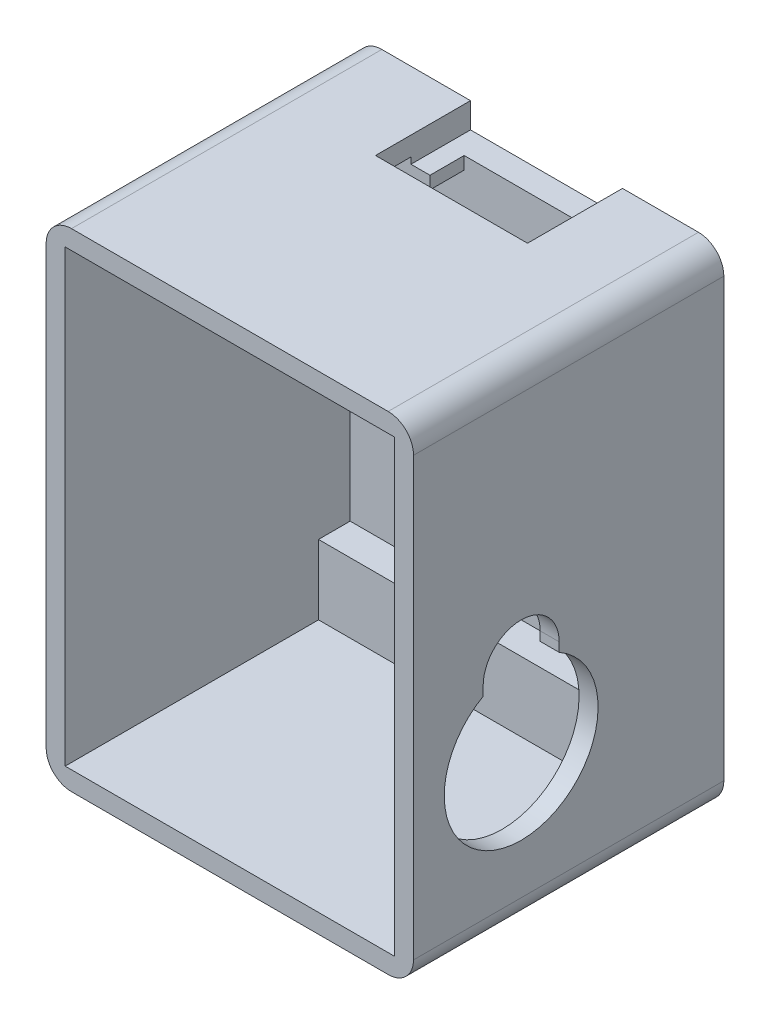
ISO-10303-21;
HEADER;
FILE_DESCRIPTION(('STEP AP214'),'2;1');
FILE_NAME('part.step','',(''),(''),'','','');
FILE_SCHEMA(('AUTOMOTIVE_DESIGN { 1 0 10303 214 1 1 1 1 }'));
ENDSEC;
DATA;
#1=APPLICATION_CONTEXT('core data for automotive mechanical design processes');
#2=APPLICATION_PROTOCOL_DEFINITION('international standard','automotive_design',2000,#1);
#3=PRODUCT_CONTEXT('',#1,'mechanical');
#4=PRODUCT('Part','Part','',(#3));
#5=PRODUCT_RELATED_PRODUCT_CATEGORY('part','',(#4));
#6=PRODUCT_DEFINITION_FORMATION('','',#4);
#7=PRODUCT_DEFINITION_CONTEXT('part definition',#1,'design');
#8=PRODUCT_DEFINITION('design','',#6,#7);
#9=PRODUCT_DEFINITION_SHAPE('','',#8);
#10=(LENGTH_UNIT() NAMED_UNIT(*) SI_UNIT(.MILLI.,.METRE.));
#11=(NAMED_UNIT(*) PLANE_ANGLE_UNIT() SI_UNIT($,.RADIAN.));
#12=(NAMED_UNIT(*) SI_UNIT($,.STERADIAN.) SOLID_ANGLE_UNIT());
#13=UNCERTAINTY_MEASURE_WITH_UNIT(LENGTH_MEASURE(1.E-05),#10,'distance_accuracy_value','');
#14=(GEOMETRIC_REPRESENTATION_CONTEXT(3) GLOBAL_UNCERTAINTY_ASSIGNED_CONTEXT((#13)) GLOBAL_UNIT_ASSIGNED_CONTEXT((#10,
#11,#12)) REPRESENTATION_CONTEXT('',''));
#15=CARTESIAN_POINT('',(0.,0.,0.));
#16=DIRECTION('',(0.,0.,1.));
#17=DIRECTION('',(1.,0.,0.));
#18=AXIS2_PLACEMENT_3D('',#15,#16,#17);
#19=CARTESIAN_POINT('',(27.5,0.,24.));
#20=DIRECTION('',(-1.,0.,0.));
#21=DIRECTION('',(0.,-1.,0.));
#22=AXIS2_PLACEMENT_3D('',#19,#20,#21);
#23=PLANE('',#22);
#24=DIRECTION('',(0.,0.,-1.));
#25=VECTOR('',#24,1.);
#26=CARTESIAN_POINT('',(27.5,-1.5,24.));
#27=LINE('',#26,#25);
#28=CARTESIAN_POINT('',(27.5,-1.5,24.));
#29=VERTEX_POINT('',#28);
#30=CARTESIAN_POINT('',(27.5,-1.5,4.2));
#31=VERTEX_POINT('',#30);
#32=EDGE_CURVE('E388',#29,#31,#27,.T.);
#33=ORIENTED_EDGE('',*,*,#32,.T.);
#34=DIRECTION('',(0.,1.,0.));
#35=VECTOR('',#34,1.);
#36=CARTESIAN_POINT('',(27.5,-1.5,4.2));
#37=LINE('',#36,#35);
#38=CARTESIAN_POINT('',(27.5,-3.,4.2));
#39=VERTEX_POINT('',#38);
#40=EDGE_CURVE('E341',#39,#31,#37,.T.);
#41=ORIENTED_EDGE('',*,*,#40,.F.);
#42=DIRECTION('',(0.,0.,1.));
#43=VECTOR('',#42,1.);
#44=CARTESIAN_POINT('',(27.5,-3.,4.2));
#45=LINE('',#44,#43);
#46=CARTESIAN_POINT('',(27.5,-3.,1.5));
#47=VERTEX_POINT('',#46);
#48=EDGE_CURVE('E346',#47,#39,#45,.T.);
#49=ORIENTED_EDGE('',*,*,#48,.F.);
#50=DIRECTION('',(0.,1.,0.));
#51=VECTOR('',#50,1.);
#52=CARTESIAN_POINT('',(27.5,0.,1.5));
#53=LINE('',#52,#51);
#54=CARTESIAN_POINT('',(27.5,-31.5,1.5));
#55=VERTEX_POINT('',#54);
#56=EDGE_CURVE('E379',#55,#47,#53,.T.);
#57=ORIENTED_EDGE('',*,*,#56,.F.);
#58=DIRECTION('',(0.,0.,-1.));
#59=VECTOR('',#58,1.);
#60=CARTESIAN_POINT('',(27.5,-31.5,4.));
#61=LINE('',#60,#59);
#62=CARTESIAN_POINT('',(27.5,-31.5,4.));
#63=VERTEX_POINT('',#62);
#64=EDGE_CURVE('E375',#63,#55,#61,.T.);
#65=ORIENTED_EDGE('',*,*,#64,.F.);
#66=DIRECTION('',(0.,1.,0.));
#67=VECTOR('',#66,1.);
#68=CARTESIAN_POINT('',(27.5,-31.5,4.));
#69=LINE('',#68,#67);
#70=CARTESIAN_POINT('',(27.5,-37.,4.));
#71=VERTEX_POINT('',#70);
#72=EDGE_CURVE('E361',#71,#63,#69,.T.);
#73=ORIENTED_EDGE('',*,*,#72,.F.);
#74=DIRECTION('',(0.,0.,-1.));
#75=VECTOR('',#74,1.);
#76=CARTESIAN_POINT('',(27.5,-37.,24.));
#77=LINE('',#76,#75);
#78=CARTESIAN_POINT('',(27.5,-37.,24.));
#79=VERTEX_POINT('',#78);
#80=EDGE_CURVE('E384',#79,#71,#77,.T.);
#81=ORIENTED_EDGE('',*,*,#80,.F.);
#82=DIRECTION('',(0.,1.,0.));
#83=VECTOR('',#82,1.);
#84=CARTESIAN_POINT('',(27.5,0.,24.));
#85=LINE('',#84,#83);
#86=EDGE_CURVE('E400',#79,#29,#85,.T.);
#87=ORIENTED_EDGE('',*,*,#86,.T.);
#88=EDGE_LOOP('',(#33,#41,#49,#57,#65,#73,#81,#87));
#89=FACE_BOUND('',#88,.T.);
#90=CARTESIAN_POINT('',(27.5,-26.5,15.5));
#91=DIRECTION('',(1.,0.,0.));
#92=DIRECTION('',(0.,1.,0.));
#93=AXIS2_PLACEMENT_3D('',#90,#91,#92);
#94=CIRCLE('',#93,6.07214716167935);
#95=CARTESIAN_POINT('',(27.5,-21.2207035361622,18.5));
#96=VERTEX_POINT('',#95);
#97=CARTESIAN_POINT('',(27.5,-21.2207035361622,12.5));
#98=VERTEX_POINT('',#97);
#99=EDGE_CURVE('E237',#96,#98,#94,.T.);
#100=ORIENTED_EDGE('',*,*,#99,.T.);
#101=DIRECTION('',(0.,-1.,0.));
#102=VECTOR('',#101,1.);
#103=CARTESIAN_POINT('',(27.5,0.,12.5));
#104=LINE('',#103,#102);
#105=CARTESIAN_POINT('',(27.5,-20.5,12.5));
#106=VERTEX_POINT('',#105);
#107=EDGE_CURVE('E231',#106,#98,#104,.T.);
#108=ORIENTED_EDGE('',*,*,#107,.F.);
#109=CARTESIAN_POINT('',(27.5,-20.5,15.5));
#110=DIRECTION('',(1.,0.,0.));
#111=DIRECTION('',(0.,1.,0.));
#112=AXIS2_PLACEMENT_3D('',#109,#110,#111);
#113=CIRCLE('',#112,3.);
#114=CARTESIAN_POINT('',(27.5,-20.5,18.5));
#115=VERTEX_POINT('',#114);
#116=EDGE_CURVE('E240',#106,#115,#113,.T.);
#117=ORIENTED_EDGE('',*,*,#116,.T.);
#118=DIRECTION('',(0.,-1.,0.));
#119=VECTOR('',#118,1.);
#120=CARTESIAN_POINT('',(27.5,0.,18.5));
#121=LINE('',#120,#119);
#122=EDGE_CURVE('E49',#115,#96,#121,.T.);
#123=ORIENTED_EDGE('',*,*,#122,.T.);
#124=EDGE_LOOP('',(#100,#108,#117,#123));
#125=FACE_BOUND('',#124,.T.);
#126=ADVANCED_FACE('F34',(#89,#125),#23,.T.);
#127=CARTESIAN_POINT('',(29.,0.,24.));
#128=DIRECTION('',(-1.,0.,0.));
#129=DIRECTION('',(0.,-1.,0.));
#130=AXIS2_PLACEMENT_3D('',#127,#128,#129);
#131=PLANE('',#130);
#132=DIRECTION('',(0.,-1.,0.));
#133=VECTOR('',#132,1.);
#134=CARTESIAN_POINT('',(29.,0.,-0.5));
#135=LINE('',#134,#133);
#136=CARTESIAN_POINT('',(29.,-2.,-0.5));
#137=VERTEX_POINT('',#136);
#138=CARTESIAN_POINT('',(29.,-36.5,-0.5));
#139=VERTEX_POINT('',#138);
#140=EDGE_CURVE('E316',#137,#139,#135,.T.);
#141=ORIENTED_EDGE('',*,*,#140,.F.);
#142=DIRECTION('',(0.,0.,-1.));
#143=VECTOR('',#142,1.);
#144=CARTESIAN_POINT('',(29.,-2.,24.));
#145=LINE('',#144,#143);
#146=CARTESIAN_POINT('',(29.,-2.,24.));
#147=VERTEX_POINT('',#146);
#148=EDGE_CURVE('E431',#137,#147,#145,.F.);
#149=ORIENTED_EDGE('',*,*,#148,.T.);
#150=DIRECTION('',(0.,1.,0.));
#151=VECTOR('',#150,1.);
#152=CARTESIAN_POINT('',(29.,0.,24.));
#153=LINE('',#152,#151);
#154=CARTESIAN_POINT('',(29.,-36.5,24.));
#155=VERTEX_POINT('',#154);
#156=EDGE_CURVE('E409',#155,#147,#153,.T.);
#157=ORIENTED_EDGE('',*,*,#156,.F.);
#158=DIRECTION('',(0.,0.,-1.));
#159=VECTOR('',#158,1.);
#160=CARTESIAN_POINT('',(29.,-36.5,24.));
#161=LINE('',#160,#159);
#162=EDGE_CURVE('E428',#155,#139,#161,.T.);
#163=ORIENTED_EDGE('',*,*,#162,.T.);
#164=EDGE_LOOP('',(#141,#149,#157,#163));
#165=FACE_BOUND('',#164,.T.);
#166=DIRECTION('',(0.,-1.,0.));
#167=VECTOR('',#166,1.);
#168=CARTESIAN_POINT('',(29.,0.,12.5));
#169=LINE('',#168,#167);
#170=CARTESIAN_POINT('',(29.,-20.5,12.5));
#171=VERTEX_POINT('',#170);
#172=CARTESIAN_POINT('',(29.,-21.2207035361622,12.5));
#173=VERTEX_POINT('',#172);
#174=EDGE_CURVE('E57',#171,#173,#169,.T.);
#175=ORIENTED_EDGE('',*,*,#174,.T.);
#176=CARTESIAN_POINT('',(29.,-26.5,15.5));
#177=DIRECTION('',(1.,0.,0.));
#178=DIRECTION('',(0.,1.,0.));
#179=AXIS2_PLACEMENT_3D('',#176,#177,#178);
#180=CIRCLE('',#179,6.07214716167935);
#181=CARTESIAN_POINT('',(29.,-21.2207035361622,18.5));
#182=VERTEX_POINT('',#181);
#183=EDGE_CURVE('E246',#182,#173,#180,.T.);
#184=ORIENTED_EDGE('',*,*,#183,.F.);
#185=DIRECTION('',(0.,-1.,0.));
#186=VECTOR('',#185,1.);
#187=CARTESIAN_POINT('',(29.,0.,18.5));
#188=LINE('',#187,#186);
#189=CARTESIAN_POINT('',(29.,-20.5,18.5));
#190=VERTEX_POINT('',#189);
#191=EDGE_CURVE('E249',#190,#182,#188,.T.);
#192=ORIENTED_EDGE('',*,*,#191,.F.);
#193=CARTESIAN_POINT('',(29.,-20.5,15.5));
#194=DIRECTION('',(1.,0.,0.));
#195=DIRECTION('',(0.,1.,0.));
#196=AXIS2_PLACEMENT_3D('',#193,#194,#195);
#197=CIRCLE('',#196,3.);
#198=EDGE_CURVE('E255',#171,#190,#197,.T.);
#199=ORIENTED_EDGE('',*,*,#198,.F.);
#200=EDGE_LOOP('',(#175,#184,#192,#199));
#201=FACE_BOUND('',#200,.T.);
#202=ADVANCED_FACE('F530',(#165,#201),#131,.F.);
#203=CARTESIAN_POINT('',(0.,0.,1.5));
#204=DIRECTION('',(0.,0.,1.));
#205=DIRECTION('',(1.,0.,0.));
#206=AXIS2_PLACEMENT_3D('',#203,#204,#205);
#207=PLANE('',#206);
#208=DIRECTION('',(0.,-1.,0.));
#209=VECTOR('',#208,1.);
#210=CARTESIAN_POINT('',(19.5,-1.5,1.5));
#211=LINE('',#210,#209);
#212=CARTESIAN_POINT('',(19.5,-2.,1.5));
#213=VERTEX_POINT('',#212);
#214=CARTESIAN_POINT('',(19.5,-3.,1.5));
#215=VERTEX_POINT('',#214);
#216=EDGE_CURVE('E345',#213,#215,#211,.T.);
#217=ORIENTED_EDGE('',*,*,#216,.F.);
#218=DIRECTION('',(-1.,0.,0.));
#219=VECTOR('',#218,1.);
#220=CARTESIAN_POINT('',(0.,-2.,1.5));
#221=LINE('',#220,#219);
#222=CARTESIAN_POINT('',(10.5,-2.,1.5));
#223=VERTEX_POINT('',#222);
#224=EDGE_CURVE('E294',#213,#223,#221,.T.);
#225=ORIENTED_EDGE('',*,*,#224,.T.);
#226=DIRECTION('',(0.,1.,0.));
#227=VECTOR('',#226,1.);
#228=CARTESIAN_POINT('',(10.5,-1.5,1.5));
#229=LINE('',#228,#227);
#230=CARTESIAN_POINT('',(10.5,-3.,1.5));
#231=VERTEX_POINT('',#230);
#232=EDGE_CURVE('E328',#231,#223,#229,.T.);
#233=ORIENTED_EDGE('',*,*,#232,.F.);
#234=DIRECTION('',(-1.,0.,0.));
#235=VECTOR('',#234,1.);
#236=CARTESIAN_POINT('',(10.5,-3.,1.5));
#237=LINE('',#236,#235);
#238=CARTESIAN_POINT('',(1.5,-3.,1.5));
#239=VERTEX_POINT('',#238);
#240=EDGE_CURVE('E335',#231,#239,#237,.T.);
#241=ORIENTED_EDGE('',*,*,#240,.T.);
#242=DIRECTION('',(0.,-1.,0.));
#243=VECTOR('',#242,1.);
#244=CARTESIAN_POINT('',(1.5,0.,1.5));
#245=LINE('',#244,#243);
#246=CARTESIAN_POINT('',(1.5,-31.5,1.5));
#247=VERTEX_POINT('',#246);
#248=EDGE_CURVE('E377',#239,#247,#245,.T.);
#249=ORIENTED_EDGE('',*,*,#248,.T.);
#250=DIRECTION('',(-1.,0.,0.));
#251=VECTOR('',#250,1.);
#252=CARTESIAN_POINT('',(27.5,-31.5,1.5));
#253=LINE('',#252,#251);
#254=EDGE_CURVE('E360',#55,#247,#253,.T.);
#255=ORIENTED_EDGE('',*,*,#254,.F.);
#256=ORIENTED_EDGE('',*,*,#56,.T.);
#257=DIRECTION('',(1.,0.,0.));
#258=VECTOR('',#257,1.);
#259=CARTESIAN_POINT('',(19.5,-3.,1.5));
#260=LINE('',#259,#258);
#261=EDGE_CURVE('E356',#215,#47,#260,.T.);
#262=ORIENTED_EDGE('',*,*,#261,.F.);
#263=EDGE_LOOP('',(#217,#225,#233,#241,#249,#255,#256,#262));
#264=FACE_BOUND('',#263,.T.);
#265=ADVANCED_FACE('F495',(#264),#207,.T.);
#266=CARTESIAN_POINT('',(0.,-1.5,24.));
#267=DIRECTION('',(0.,-1.,0.));
#268=DIRECTION('',(0.,0.,-1.));
#269=AXIS2_PLACEMENT_3D('',#266,#267,#268);
#270=PLANE('',#269);
#271=DIRECTION('',(1.,0.,0.));
#272=VECTOR('',#271,1.);
#273=CARTESIAN_POINT('',(0.,-1.5,7.));
#274=LINE('',#273,#272);
#275=CARTESIAN_POINT('',(9.,-1.5,7.));
#276=VERTEX_POINT('',#275);
#277=CARTESIAN_POINT('',(21.,-1.5,7.));
#278=VERTEX_POINT('',#277);
#279=EDGE_CURVE('E306',#276,#278,#274,.T.);
#280=ORIENTED_EDGE('',*,*,#279,.T.);
#281=DIRECTION('',(0.,0.,-1.));
#282=VECTOR('',#281,1.);
#283=CARTESIAN_POINT('',(21.,-1.5,24.));
#284=LINE('',#283,#282);
#285=CARTESIAN_POINT('',(21.,-1.5,4.2));
#286=VERTEX_POINT('',#285);
#287=EDGE_CURVE('E303',#278,#286,#284,.T.);
#288=ORIENTED_EDGE('',*,*,#287,.T.);
#289=DIRECTION('',(1.,0.,0.));
#290=VECTOR('',#289,1.);
#291=CARTESIAN_POINT('',(19.5,-1.5,4.2));
#292=LINE('',#291,#290);
#293=EDGE_CURVE('E358',#286,#31,#292,.T.);
#294=ORIENTED_EDGE('',*,*,#293,.T.);
#295=ORIENTED_EDGE('',*,*,#32,.F.);
#296=DIRECTION('',(-1.,0.,0.));
#297=VECTOR('',#296,1.);
#298=CARTESIAN_POINT('',(0.,-1.5,24.));
#299=LINE('',#298,#297);
#300=CARTESIAN_POINT('',(1.5,-1.5,24.));
#301=VERTEX_POINT('',#300);
#302=EDGE_CURVE('E389',#29,#301,#299,.T.);
#303=ORIENTED_EDGE('',*,*,#302,.T.);
#304=DIRECTION('',(0.,0.,-1.));
#305=VECTOR('',#304,1.);
#306=CARTESIAN_POINT('',(1.5,-1.5,24.));
#307=LINE('',#306,#305);
#308=CARTESIAN_POINT('',(1.5,-1.5,4.2));
#309=VERTEX_POINT('',#308);
#310=EDGE_CURVE('E385',#301,#309,#307,.T.);
#311=ORIENTED_EDGE('',*,*,#310,.T.);
#312=DIRECTION('',(-1.,0.,0.));
#313=VECTOR('',#312,1.);
#314=CARTESIAN_POINT('',(10.5,-1.5,4.2));
#315=LINE('',#314,#313);
#316=CARTESIAN_POINT('',(9.,-1.5,4.2));
#317=VERTEX_POINT('',#316);
#318=EDGE_CURVE('E331',#317,#309,#315,.T.);
#319=ORIENTED_EDGE('',*,*,#318,.F.);
#320=DIRECTION('',(0.,0.,1.));
#321=VECTOR('',#320,1.);
#322=CARTESIAN_POINT('',(9.,-1.5,24.));
#323=LINE('',#322,#321);
#324=EDGE_CURVE('E286',#317,#276,#323,.T.);
#325=ORIENTED_EDGE('',*,*,#324,.T.);
#326=EDGE_LOOP('',(#280,#288,#294,#295,#303,#311,#319,#325));
#327=FACE_BOUND('',#326,.T.);
#328=ADVANCED_FACE('F477',(#327),#270,.T.);
#329=CARTESIAN_POINT('',(0.,0.,24.));
#330=DIRECTION('',(0.,-1.,0.));
#331=DIRECTION('',(0.,0.,-1.));
#332=AXIS2_PLACEMENT_3D('',#329,#330,#331);
#333=PLANE('',#332);
#334=DIRECTION('',(0.,0.,1.));
#335=VECTOR('',#334,1.);
#336=CARTESIAN_POINT('',(21.,0.,-1.5));
#337=LINE('',#336,#335);
#338=CARTESIAN_POINT('',(21.,0.,-0.5));
#339=VERTEX_POINT('',#338);
#340=CARTESIAN_POINT('',(21.,0.,7.));
#341=VERTEX_POINT('',#340);
#342=EDGE_CURVE('E272',#339,#341,#337,.T.);
#343=ORIENTED_EDGE('',*,*,#342,.T.);
#344=DIRECTION('',(1.,0.,0.));
#345=VECTOR('',#344,1.);
#346=CARTESIAN_POINT('',(21.,0.,7.));
#347=LINE('',#346,#345);
#348=CARTESIAN_POINT('',(9.,0.,7.));
#349=VERTEX_POINT('',#348);
#350=EDGE_CURVE('E269',#349,#341,#347,.T.);
#351=ORIENTED_EDGE('',*,*,#350,.F.);
#352=DIRECTION('',(0.,0.,1.));
#353=VECTOR('',#352,1.);
#354=CARTESIAN_POINT('',(9.,0.,-1.5));
#355=LINE('',#354,#353);
#356=CARTESIAN_POINT('',(9.,0.,-0.5));
#357=VERTEX_POINT('',#356);
#358=EDGE_CURVE('E275',#357,#349,#355,.T.);
#359=ORIENTED_EDGE('',*,*,#358,.F.);
#360=DIRECTION('',(1.,0.,0.));
#361=VECTOR('',#360,1.);
#362=CARTESIAN_POINT('',(0.,0.,-0.5));
#363=LINE('',#362,#361);
#364=CARTESIAN_POINT('',(2.,0.,-0.5));
#365=VERTEX_POINT('',#364);
#366=EDGE_CURVE('E313',#365,#357,#363,.T.);
#367=ORIENTED_EDGE('',*,*,#366,.F.);
#368=DIRECTION('',(0.,0.,-1.));
#369=VECTOR('',#368,1.);
#370=CARTESIAN_POINT('',(2.,0.,24.));
#371=LINE('',#370,#369);
#372=CARTESIAN_POINT('',(2.,0.,24.));
#373=VERTEX_POINT('',#372);
#374=EDGE_CURVE('E415',#365,#373,#371,.F.);
#375=ORIENTED_EDGE('',*,*,#374,.T.);
#376=DIRECTION('',(-1.,0.,0.));
#377=VECTOR('',#376,1.);
#378=CARTESIAN_POINT('',(0.,0.,24.));
#379=LINE('',#378,#377);
#380=CARTESIAN_POINT('',(27.,0.,24.));
#381=VERTEX_POINT('',#380);
#382=EDGE_CURVE('E412',#381,#373,#379,.T.);
#383=ORIENTED_EDGE('',*,*,#382,.F.);
#384=DIRECTION('',(0.,0.,-1.));
#385=VECTOR('',#384,1.);
#386=CARTESIAN_POINT('',(27.,0.,24.));
#387=LINE('',#386,#385);
#388=CARTESIAN_POINT('',(27.,0.,-0.5));
#389=VERTEX_POINT('',#388);
#390=EDGE_CURVE('E417',#381,#389,#387,.T.);
#391=ORIENTED_EDGE('',*,*,#390,.T.);
#392=EDGE_CURVE('E312',#339,#389,#363,.T.);
#393=ORIENTED_EDGE('',*,*,#392,.F.);
#394=EDGE_LOOP('',(#343,#351,#359,#367,#375,#383,#391,#393));
#395=FACE_BOUND('',#394,.T.);
#396=ADVANCED_FACE('F469',(#395),#333,.F.);
#397=CARTESIAN_POINT('',(19.5,-1.5,4.2));
#398=DIRECTION('',(0.,0.,-1.));
#399=DIRECTION('',(-1.,0.,0.));
#400=AXIS2_PLACEMENT_3D('',#397,#398,#399);
#401=PLANE('',#400);
#402=DIRECTION('',(0.,1.,0.));
#403=VECTOR('',#402,1.);
#404=CARTESIAN_POINT('',(21.,-1.5,4.2));
#405=LINE('',#404,#403);
#406=CARTESIAN_POINT('',(21.,-2.,4.2));
#407=VERTEX_POINT('',#406);
#408=EDGE_CURVE('E301',#407,#286,#405,.T.);
#409=ORIENTED_EDGE('',*,*,#408,.F.);
#410=DIRECTION('',(1.,0.,0.));
#411=VECTOR('',#410,1.);
#412=CARTESIAN_POINT('',(19.5,-2.,4.2));
#413=LINE('',#412,#411);
#414=CARTESIAN_POINT('',(19.5,-2.,4.2));
#415=VERTEX_POINT('',#414);
#416=EDGE_CURVE('E299',#415,#407,#413,.T.);
#417=ORIENTED_EDGE('',*,*,#416,.F.);
#418=DIRECTION('',(0.,1.,0.));
#419=VECTOR('',#418,1.);
#420=CARTESIAN_POINT('',(19.5,-1.5,4.2));
#421=LINE('',#420,#419);
#422=CARTESIAN_POINT('',(19.5,-3.,4.2));
#423=VERTEX_POINT('',#422);
#424=EDGE_CURVE('E342',#423,#415,#421,.T.);
#425=ORIENTED_EDGE('',*,*,#424,.F.);
#426=DIRECTION('',(1.,0.,0.));
#427=VECTOR('',#426,1.);
#428=CARTESIAN_POINT('',(19.5,-3.,4.2));
#429=LINE('',#428,#427);
#430=EDGE_CURVE('E350',#423,#39,#429,.T.);
#431=ORIENTED_EDGE('',*,*,#430,.T.);
#432=ORIENTED_EDGE('',*,*,#40,.T.);
#433=ORIENTED_EDGE('',*,*,#293,.F.);
#434=EDGE_LOOP('',(#409,#417,#425,#431,#432,#433));
#435=FACE_BOUND('',#434,.T.);
#436=ADVANCED_FACE('F518',(#435),#401,.F.);
#437=CARTESIAN_POINT('',(19.5,0.,0.));
#438=DIRECTION('',(1.,0.,0.));
#439=DIRECTION('',(0.,0.,-1.));
#440=AXIS2_PLACEMENT_3D('',#437,#438,#439);
#441=PLANE('',#440);
#442=DIRECTION('',(0.,0.,1.));
#443=VECTOR('',#442,1.);
#444=CARTESIAN_POINT('',(19.5,-2.,0.));
#445=LINE('',#444,#443);
#446=EDGE_CURVE('E297',#213,#415,#445,.T.);
#447=ORIENTED_EDGE('',*,*,#446,.F.);
#448=ORIENTED_EDGE('',*,*,#216,.T.);
#449=DIRECTION('',(0.,0.,1.));
#450=VECTOR('',#449,1.);
#451=CARTESIAN_POINT('',(19.5,-3.,4.2));
#452=LINE('',#451,#450);
#453=EDGE_CURVE('E348',#215,#423,#452,.T.);
#454=ORIENTED_EDGE('',*,*,#453,.T.);
#455=ORIENTED_EDGE('',*,*,#424,.T.);
#456=EDGE_LOOP('',(#447,#448,#454,#455));
#457=FACE_BOUND('',#456,.T.);
#458=ADVANCED_FACE('F503',(#457),#441,.F.);
#459=CARTESIAN_POINT('',(10.5,-1.5,4.2));
#460=DIRECTION('',(0.,0.,-1.));
#461=DIRECTION('',(-1.,0.,0.));
#462=AXIS2_PLACEMENT_3D('',#459,#460,#461);
#463=PLANE('',#462);
#464=DIRECTION('',(1.,0.,0.));
#465=VECTOR('',#464,1.);
#466=CARTESIAN_POINT('',(10.5,-2.,4.2));
#467=LINE('',#466,#465);
#468=CARTESIAN_POINT('',(9.,-2.,4.2));
#469=VERTEX_POINT('',#468);
#470=CARTESIAN_POINT('',(10.5,-2.,4.2));
#471=VERTEX_POINT('',#470);
#472=EDGE_CURVE('E292',#469,#471,#467,.T.);
#473=ORIENTED_EDGE('',*,*,#472,.F.);
#474=DIRECTION('',(0.,-1.,0.));
#475=VECTOR('',#474,1.);
#476=CARTESIAN_POINT('',(9.,-1.5,4.2));
#477=LINE('',#476,#475);
#478=EDGE_CURVE('E284',#317,#469,#477,.T.);
#479=ORIENTED_EDGE('',*,*,#478,.F.);
#480=ORIENTED_EDGE('',*,*,#318,.T.);
#481=DIRECTION('',(0.,-1.,0.));
#482=VECTOR('',#481,1.);
#483=CARTESIAN_POINT('',(1.5,-1.5,4.2));
#484=LINE('',#483,#482);
#485=CARTESIAN_POINT('',(1.5,-3.,4.2));
#486=VERTEX_POINT('',#485);
#487=EDGE_CURVE('E322',#309,#486,#484,.T.);
#488=ORIENTED_EDGE('',*,*,#487,.T.);
#489=DIRECTION('',(-1.,0.,0.));
#490=VECTOR('',#489,1.);
#491=CARTESIAN_POINT('',(10.5,-3.,4.2));
#492=LINE('',#491,#490);
#493=CARTESIAN_POINT('',(10.5,-3.,4.2));
#494=VERTEX_POINT('',#493);
#495=EDGE_CURVE('E338',#494,#486,#492,.T.);
#496=ORIENTED_EDGE('',*,*,#495,.F.);
#497=DIRECTION('',(0.,-1.,0.));
#498=VECTOR('',#497,1.);
#499=CARTESIAN_POINT('',(10.5,-1.5,4.2));
#500=LINE('',#499,#498);
#501=EDGE_CURVE('E323',#471,#494,#500,.T.);
#502=ORIENTED_EDGE('',*,*,#501,.F.);
#503=EDGE_LOOP('',(#473,#479,#480,#488,#496,#502));
#504=FACE_BOUND('',#503,.T.);
#505=ADVANCED_FACE('F481',(#504),#463,.F.);
#506=CARTESIAN_POINT('',(10.5,0.,0.));
#507=DIRECTION('',(1.,0.,0.));
#508=DIRECTION('',(0.,1.,0.));
#509=AXIS2_PLACEMENT_3D('',#506,#507,#508);
#510=PLANE('',#509);
#511=ORIENTED_EDGE('',*,*,#232,.T.);
#512=DIRECTION('',(0.,0.,1.));
#513=VECTOR('',#512,1.);
#514=CARTESIAN_POINT('',(10.5,-2.,0.));
#515=LINE('',#514,#513);
#516=EDGE_CURVE('E289',#223,#471,#515,.T.);
#517=ORIENTED_EDGE('',*,*,#516,.T.);
#518=ORIENTED_EDGE('',*,*,#501,.T.);
#519=DIRECTION('',(0.,0.,-1.));
#520=VECTOR('',#519,1.);
#521=CARTESIAN_POINT('',(10.5,-3.,4.2));
#522=LINE('',#521,#520);
#523=EDGE_CURVE('E325',#494,#231,#522,.T.);
#524=ORIENTED_EDGE('',*,*,#523,.T.);
#525=EDGE_LOOP('',(#511,#517,#518,#524));
#526=FACE_BOUND('',#525,.T.);
#527=ADVANCED_FACE('F498',(#526),#510,.T.);
#528=CARTESIAN_POINT('',(0.,0.,-0.5));
#529=DIRECTION('',(0.,0.,1.));
#530=DIRECTION('',(1.,0.,0.));
#531=AXIS2_PLACEMENT_3D('',#528,#529,#530);
#532=PLANE('',#531);
#533=DIRECTION('',(0.,-1.,0.));
#534=VECTOR('',#533,1.);
#535=CARTESIAN_POINT('',(21.,0.,-0.5));
#536=LINE('',#535,#534);
#537=CARTESIAN_POINT('',(21.,-2.,-0.5));
#538=VERTEX_POINT('',#537);
#539=EDGE_CURVE('E11',#339,#538,#536,.T.);
#540=ORIENTED_EDGE('',*,*,#539,.F.);
#541=ORIENTED_EDGE('',*,*,#392,.T.);
#542=CARTESIAN_POINT('',(27.,-2.,-0.5));
#543=DIRECTION('',(0.,0.,1.));
#544=DIRECTION('',(1.,0.,0.));
#545=AXIS2_PLACEMENT_3D('',#542,#543,#544);
#546=CIRCLE('',#545,2.);
#547=EDGE_CURVE('E426',#389,#137,#546,.F.);
#548=ORIENTED_EDGE('',*,*,#547,.T.);
#549=ORIENTED_EDGE('',*,*,#140,.T.);
#550=CARTESIAN_POINT('',(27.,-36.5,-0.5));
#551=DIRECTION('',(0.,0.,1.));
#552=DIRECTION('',(1.,0.,0.));
#553=AXIS2_PLACEMENT_3D('',#550,#551,#552);
#554=CIRCLE('',#553,2.);
#555=CARTESIAN_POINT('',(27.,-38.5,-0.5));
#556=VERTEX_POINT('',#555);
#557=EDGE_CURVE('E424',#139,#556,#554,.F.);
#558=ORIENTED_EDGE('',*,*,#557,.T.);
#559=DIRECTION('',(-1.,0.,0.));
#560=VECTOR('',#559,1.);
#561=CARTESIAN_POINT('',(0.,-38.5,-0.5));
#562=LINE('',#561,#560);
#563=CARTESIAN_POINT('',(2.,-38.5,-0.5));
#564=VERTEX_POINT('',#563);
#565=EDGE_CURVE('E319',#556,#564,#562,.T.);
#566=ORIENTED_EDGE('',*,*,#565,.T.);
#567=CARTESIAN_POINT('',(2.,-36.5,-0.5));
#568=DIRECTION('',(0.,0.,1.));
#569=DIRECTION('',(1.,0.,0.));
#570=AXIS2_PLACEMENT_3D('',#567,#568,#569);
#571=CIRCLE('',#570,2.);
#572=CARTESIAN_POINT('',(0.,-36.5,-0.5));
#573=VERTEX_POINT('',#572);
#574=EDGE_CURVE('E422',#564,#573,#571,.F.);
#575=ORIENTED_EDGE('',*,*,#574,.T.);
#576=DIRECTION('',(0.,1.,0.));
#577=VECTOR('',#576,1.);
#578=CARTESIAN_POINT('',(0.,0.,-0.5));
#579=LINE('',#578,#577);
#580=CARTESIAN_POINT('',(0.,-2.,-0.5));
#581=VERTEX_POINT('',#580);
#582=EDGE_CURVE('E309',#573,#581,#579,.T.);
#583=ORIENTED_EDGE('',*,*,#582,.T.);
#584=CARTESIAN_POINT('',(2.,-2.,-0.5));
#585=DIRECTION('',(0.,0.,1.));
#586=DIRECTION('',(1.,0.,0.));
#587=AXIS2_PLACEMENT_3D('',#584,#585,#586);
#588=CIRCLE('',#587,2.);
#589=EDGE_CURVE('E420',#581,#365,#588,.F.);
#590=ORIENTED_EDGE('',*,*,#589,.T.);
#591=ORIENTED_EDGE('',*,*,#366,.T.);
#592=DIRECTION('',(0.,1.,0.));
#593=VECTOR('',#592,1.);
#594=CARTESIAN_POINT('',(9.,0.,-0.5));
#595=LINE('',#594,#593);
#596=CARTESIAN_POINT('',(9.,-2.,-0.5));
#597=VERTEX_POINT('',#596);
#598=EDGE_CURVE('E451',#597,#357,#595,.T.);
#599=ORIENTED_EDGE('',*,*,#598,.F.);
#600=DIRECTION('',(-1.,0.,0.));
#601=VECTOR('',#600,1.);
#602=CARTESIAN_POINT('',(0.,-2.,-0.5));
#603=LINE('',#602,#601);
#604=EDGE_CURVE('E42',#538,#597,#603,.T.);
#605=ORIENTED_EDGE('',*,*,#604,.F.);
#606=EDGE_LOOP('',(#540,#541,#548,#549,#558,#566,#575,#583,#590,#591,#599,#605));
#607=FACE_BOUND('',#606,.T.);
#608=ADVANCED_FACE('F461',(#607),#532,.F.);
#609=CARTESIAN_POINT('',(1.5,0.,24.));
#610=DIRECTION('',(1.,0.,0.));
#611=DIRECTION('',(0.,1.,0.));
#612=AXIS2_PLACEMENT_3D('',#609,#610,#611);
#613=PLANE('',#612);
#614=DIRECTION('',(0.,0.,-1.));
#615=VECTOR('',#614,1.);
#616=CARTESIAN_POINT('',(1.5,-3.,4.2));
#617=LINE('',#616,#615);
#618=EDGE_CURVE('E326',#486,#239,#617,.T.);
#619=ORIENTED_EDGE('',*,*,#618,.F.);
#620=ORIENTED_EDGE('',*,*,#487,.F.);
#621=ORIENTED_EDGE('',*,*,#310,.F.);
#622=DIRECTION('',(0.,-1.,0.));
#623=VECTOR('',#622,1.);
#624=CARTESIAN_POINT('',(1.5,0.,24.));
#625=LINE('',#624,#623);
#626=CARTESIAN_POINT('',(1.5,-37.,24.));
#627=VERTEX_POINT('',#626);
#628=EDGE_CURVE('E394',#301,#627,#625,.T.);
#629=ORIENTED_EDGE('',*,*,#628,.T.);
#630=DIRECTION('',(0.,0.,-1.));
#631=VECTOR('',#630,1.);
#632=CARTESIAN_POINT('',(1.5,-37.,24.));
#633=LINE('',#632,#631);
#634=CARTESIAN_POINT('',(1.5,-37.,4.));
#635=VERTEX_POINT('',#634);
#636=EDGE_CURVE('E380',#627,#635,#633,.T.);
#637=ORIENTED_EDGE('',*,*,#636,.T.);
#638=DIRECTION('',(0.,-1.,0.));
#639=VECTOR('',#638,1.);
#640=CARTESIAN_POINT('',(1.5,-31.5,4.));
#641=LINE('',#640,#639);
#642=CARTESIAN_POINT('',(1.5,-31.5,4.));
#643=VERTEX_POINT('',#642);
#644=EDGE_CURVE('E366',#643,#635,#641,.T.);
#645=ORIENTED_EDGE('',*,*,#644,.F.);
#646=DIRECTION('',(0.,0.,-1.));
#647=VECTOR('',#646,1.);
#648=CARTESIAN_POINT('',(1.5,-31.5,4.));
#649=LINE('',#648,#647);
#650=EDGE_CURVE('E370',#643,#247,#649,.T.);
#651=ORIENTED_EDGE('',*,*,#650,.T.);
#652=ORIENTED_EDGE('',*,*,#248,.F.);
#653=EDGE_LOOP('',(#619,#620,#621,#629,#637,#645,#651,#652));
#654=FACE_BOUND('',#653,.T.);
#655=ADVANCED_FACE('F485',(#654),#613,.T.);
#656=CARTESIAN_POINT('',(0.,-37.,24.));
#657=DIRECTION('',(0.,1.,0.));
#658=DIRECTION('',(0.,0.,1.));
#659=AXIS2_PLACEMENT_3D('',#656,#657,#658);
#660=PLANE('',#659);
#661=ORIENTED_EDGE('',*,*,#80,.T.);
#662=DIRECTION('',(1.,0.,0.));
#663=VECTOR('',#662,1.);
#664=CARTESIAN_POINT('',(27.5,-37.,4.));
#665=LINE('',#664,#663);
#666=EDGE_CURVE('E368',#635,#71,#665,.T.);
#667=ORIENTED_EDGE('',*,*,#666,.F.);
#668=ORIENTED_EDGE('',*,*,#636,.F.);
#669=DIRECTION('',(1.,0.,0.));
#670=VECTOR('',#669,1.);
#671=CARTESIAN_POINT('',(0.,-37.,24.));
#672=LINE('',#671,#670);
#673=EDGE_CURVE('E398',#627,#79,#672,.T.);
#674=ORIENTED_EDGE('',*,*,#673,.T.);
#675=EDGE_LOOP('',(#661,#667,#668,#674));
#676=FACE_BOUND('',#675,.T.);
#677=ADVANCED_FACE('F578',(#676),#660,.T.);
#678=CARTESIAN_POINT('',(0.,0.,24.));
#679=DIRECTION('',(1.,0.,0.));
#680=DIRECTION('',(0.,1.,0.));
#681=AXIS2_PLACEMENT_3D('',#678,#679,#680);
#682=PLANE('',#681);
#683=ORIENTED_EDGE('',*,*,#582,.F.);
#684=DIRECTION('',(0.,0.,-1.));
#685=VECTOR('',#684,1.);
#686=CARTESIAN_POINT('',(0.,-36.5,24.));
#687=LINE('',#686,#685);
#688=CARTESIAN_POINT('',(0.,-36.5,24.));
#689=VERTEX_POINT('',#688);
#690=EDGE_CURVE('E449',#573,#689,#687,.F.);
#691=ORIENTED_EDGE('',*,*,#690,.T.);
#692=DIRECTION('',(0.,-1.,0.));
#693=VECTOR('',#692,1.);
#694=CARTESIAN_POINT('',(0.,0.,24.));
#695=LINE('',#694,#693);
#696=CARTESIAN_POINT('',(0.,-2.,24.));
#697=VERTEX_POINT('',#696);
#698=EDGE_CURVE('E383',#697,#689,#695,.T.);
#699=ORIENTED_EDGE('',*,*,#698,.F.);
#700=DIRECTION('',(0.,0.,-1.));
#701=VECTOR('',#700,1.);
#702=CARTESIAN_POINT('',(0.,-2.,24.));
#703=LINE('',#702,#701);
#704=EDGE_CURVE('E446',#697,#581,#703,.T.);
#705=ORIENTED_EDGE('',*,*,#704,.T.);
#706=EDGE_LOOP('',(#683,#691,#699,#705));
#707=FACE_BOUND('',#706,.T.);
#708=ADVANCED_FACE('F549',(#707),#682,.F.);
#709=CARTESIAN_POINT('',(0.,-38.5,24.));
#710=DIRECTION('',(0.,1.,0.));
#711=DIRECTION('',(0.,0.,1.));
#712=AXIS2_PLACEMENT_3D('',#709,#710,#711);
#713=PLANE('',#712);
#714=ORIENTED_EDGE('',*,*,#565,.F.);
#715=DIRECTION('',(0.,0.,-1.));
#716=VECTOR('',#715,1.);
#717=CARTESIAN_POINT('',(27.,-38.5,24.));
#718=LINE('',#717,#716);
#719=CARTESIAN_POINT('',(27.,-38.5,24.));
#720=VERTEX_POINT('',#719);
#721=EDGE_CURVE('E444',#556,#720,#718,.F.);
#722=ORIENTED_EDGE('',*,*,#721,.T.);
#723=DIRECTION('',(1.,0.,0.));
#724=VECTOR('',#723,1.);
#725=CARTESIAN_POINT('',(0.,-38.5,24.));
#726=LINE('',#725,#724);
#727=CARTESIAN_POINT('',(2.,-38.5,24.));
#728=VERTEX_POINT('',#727);
#729=EDGE_CURVE('E406',#728,#720,#726,.T.);
#730=ORIENTED_EDGE('',*,*,#729,.F.);
#731=DIRECTION('',(0.,0.,-1.));
#732=VECTOR('',#731,1.);
#733=CARTESIAN_POINT('',(2.,-38.5,24.));
#734=LINE('',#733,#732);
#735=EDGE_CURVE('E441',#728,#564,#734,.T.);
#736=ORIENTED_EDGE('',*,*,#735,.T.);
#737=EDGE_LOOP('',(#714,#722,#730,#736));
#738=FACE_BOUND('',#737,.T.);
#739=ADVANCED_FACE('F540',(#738),#713,.F.);
#740=CARTESIAN_POINT('',(0.,0.,24.));
#741=DIRECTION('',(0.,0.,1.));
#742=DIRECTION('',(1.,0.,0.));
#743=AXIS2_PLACEMENT_3D('',#740,#741,#742);
#744=PLANE('',#743);
#745=ORIENTED_EDGE('',*,*,#628,.F.);
#746=ORIENTED_EDGE('',*,*,#302,.F.);
#747=ORIENTED_EDGE('',*,*,#86,.F.);
#748=ORIENTED_EDGE('',*,*,#673,.F.);
#749=EDGE_LOOP('',(#745,#746,#747,#748));
#750=FACE_BOUND('',#749,.T.);
#751=ORIENTED_EDGE('',*,*,#156,.T.);
#752=CARTESIAN_POINT('',(27.,-2.,24.));
#753=DIRECTION('',(0.,0.,1.));
#754=DIRECTION('',(1.,0.,0.));
#755=AXIS2_PLACEMENT_3D('',#752,#753,#754);
#756=CIRCLE('',#755,2.);
#757=EDGE_CURVE('E439',#147,#381,#756,.T.);
#758=ORIENTED_EDGE('',*,*,#757,.T.);
#759=ORIENTED_EDGE('',*,*,#382,.T.);
#760=CARTESIAN_POINT('',(2.,-2.,24.));
#761=DIRECTION('',(0.,0.,1.));
#762=DIRECTION('',(1.,0.,0.));
#763=AXIS2_PLACEMENT_3D('',#760,#761,#762);
#764=CIRCLE('',#763,2.);
#765=EDGE_CURVE('E433',#373,#697,#764,.T.);
#766=ORIENTED_EDGE('',*,*,#765,.T.);
#767=ORIENTED_EDGE('',*,*,#698,.T.);
#768=CARTESIAN_POINT('',(2.,-36.5,24.));
#769=DIRECTION('',(0.,0.,1.));
#770=DIRECTION('',(1.,0.,0.));
#771=AXIS2_PLACEMENT_3D('',#768,#769,#770);
#772=CIRCLE('',#771,2.);
#773=EDGE_CURVE('E435',#689,#728,#772,.T.);
#774=ORIENTED_EDGE('',*,*,#773,.T.);
#775=ORIENTED_EDGE('',*,*,#729,.T.);
#776=CARTESIAN_POINT('',(27.,-36.5,24.));
#777=DIRECTION('',(0.,0.,1.));
#778=DIRECTION('',(1.,0.,0.));
#779=AXIS2_PLACEMENT_3D('',#776,#777,#778);
#780=CIRCLE('',#779,2.);
#781=EDGE_CURVE('E437',#720,#155,#780,.T.);
#782=ORIENTED_EDGE('',*,*,#781,.T.);
#783=EDGE_LOOP('',(#751,#758,#759,#766,#767,#774,#775,#782));
#784=FACE_BOUND('',#783,.T.);
#785=ADVANCED_FACE('F555',(#750,#784),#744,.T.);
#786=CARTESIAN_POINT('',(27.5,-31.5,4.));
#787=DIRECTION('',(0.,-1.,0.));
#788=DIRECTION('',(0.,0.,-1.));
#789=AXIS2_PLACEMENT_3D('',#786,#787,#788);
#790=PLANE('',#789);
#791=ORIENTED_EDGE('',*,*,#254,.T.);
#792=ORIENTED_EDGE('',*,*,#650,.F.);
#793=DIRECTION('',(-1.,0.,0.));
#794=VECTOR('',#793,1.);
#795=CARTESIAN_POINT('',(27.5,-31.5,4.));
#796=LINE('',#795,#794);
#797=EDGE_CURVE('E364',#63,#643,#796,.T.);
#798=ORIENTED_EDGE('',*,*,#797,.F.);
#799=ORIENTED_EDGE('',*,*,#64,.T.);
#800=EDGE_LOOP('',(#791,#792,#798,#799));
#801=FACE_BOUND('',#800,.T.);
#802=ADVANCED_FACE('F557',(#801),#790,.F.);
#803=CARTESIAN_POINT('',(0.,0.,4.));
#804=DIRECTION('',(0.,0.,-1.));
#805=DIRECTION('',(-1.,0.,0.));
#806=AXIS2_PLACEMENT_3D('',#803,#804,#805);
#807=PLANE('',#806);
#808=ORIENTED_EDGE('',*,*,#72,.T.);
#809=ORIENTED_EDGE('',*,*,#797,.T.);
#810=ORIENTED_EDGE('',*,*,#644,.T.);
#811=ORIENTED_EDGE('',*,*,#666,.T.);
#812=EDGE_LOOP('',(#808,#809,#810,#811));
#813=FACE_BOUND('',#812,.T.);
#814=ADVANCED_FACE('F564',(#813),#807,.F.);
#815=CARTESIAN_POINT('',(19.5,-3.,4.2));
#816=DIRECTION('',(0.,1.,0.));
#817=DIRECTION('',(-1.,0.,0.));
#818=AXIS2_PLACEMENT_3D('',#815,#816,#817);
#819=PLANE('',#818);
#820=ORIENTED_EDGE('',*,*,#48,.T.);
#821=ORIENTED_EDGE('',*,*,#430,.F.);
#822=ORIENTED_EDGE('',*,*,#453,.F.);
#823=ORIENTED_EDGE('',*,*,#261,.T.);
#824=EDGE_LOOP('',(#820,#821,#822,#823));
#825=FACE_BOUND('',#824,.T.);
#826=ADVANCED_FACE('F510',(#825),#819,.F.);
#827=CARTESIAN_POINT('',(10.5,-3.,4.2));
#828=DIRECTION('',(0.,1.,0.));
#829=DIRECTION('',(-1.,0.,0.));
#830=AXIS2_PLACEMENT_3D('',#827,#828,#829);
#831=PLANE('',#830);
#832=ORIENTED_EDGE('',*,*,#618,.T.);
#833=ORIENTED_EDGE('',*,*,#240,.F.);
#834=ORIENTED_EDGE('',*,*,#523,.F.);
#835=ORIENTED_EDGE('',*,*,#495,.T.);
#836=EDGE_LOOP('',(#832,#833,#834,#835));
#837=FACE_BOUND('',#836,.T.);
#838=ADVANCED_FACE('F490',(#837),#831,.F.);
#839=CARTESIAN_POINT('',(27.,-2.,24.));
#840=DIRECTION('',(0.,0.,-1.));
#841=DIRECTION('',(-1.,0.,0.));
#842=AXIS2_PLACEMENT_3D('',#839,#840,#841);
#843=CYLINDRICAL_SURFACE('',#842,2.);
#844=ORIENTED_EDGE('',*,*,#757,.F.);
#845=ORIENTED_EDGE('',*,*,#148,.F.);
#846=ORIENTED_EDGE('',*,*,#547,.F.);
#847=ORIENTED_EDGE('',*,*,#390,.F.);
#848=EDGE_LOOP('',(#844,#845,#846,#847));
#849=FACE_BOUND('',#848,.T.);
#850=ADVANCED_FACE('F526',(#849),#843,.T.);
#851=CARTESIAN_POINT('',(27.,-36.5,24.));
#852=DIRECTION('',(0.,0.,-1.));
#853=DIRECTION('',(-1.,0.,0.));
#854=AXIS2_PLACEMENT_3D('',#851,#852,#853);
#855=CYLINDRICAL_SURFACE('',#854,2.);
#856=ORIENTED_EDGE('',*,*,#781,.F.);
#857=ORIENTED_EDGE('',*,*,#721,.F.);
#858=ORIENTED_EDGE('',*,*,#557,.F.);
#859=ORIENTED_EDGE('',*,*,#162,.F.);
#860=EDGE_LOOP('',(#856,#857,#858,#859));
#861=FACE_BOUND('',#860,.T.);
#862=ADVANCED_FACE('F536',(#861),#855,.T.);
#863=CARTESIAN_POINT('',(2.,-36.5,24.));
#864=DIRECTION('',(0.,0.,-1.));
#865=DIRECTION('',(-1.,0.,0.));
#866=AXIS2_PLACEMENT_3D('',#863,#864,#865);
#867=CYLINDRICAL_SURFACE('',#866,2.);
#868=ORIENTED_EDGE('',*,*,#773,.F.);
#869=ORIENTED_EDGE('',*,*,#690,.F.);
#870=ORIENTED_EDGE('',*,*,#574,.F.);
#871=ORIENTED_EDGE('',*,*,#735,.F.);
#872=EDGE_LOOP('',(#868,#869,#870,#871));
#873=FACE_BOUND('',#872,.T.);
#874=ADVANCED_FACE('F545',(#873),#867,.T.);
#875=CARTESIAN_POINT('',(2.,-2.,24.));
#876=DIRECTION('',(0.,0.,-1.));
#877=DIRECTION('',(-1.,0.,0.));
#878=AXIS2_PLACEMENT_3D('',#875,#876,#877);
#879=CYLINDRICAL_SURFACE('',#878,2.);
#880=ORIENTED_EDGE('',*,*,#765,.F.);
#881=ORIENTED_EDGE('',*,*,#374,.F.);
#882=ORIENTED_EDGE('',*,*,#589,.F.);
#883=ORIENTED_EDGE('',*,*,#704,.F.);
#884=EDGE_LOOP('',(#880,#881,#882,#883));
#885=FACE_BOUND('',#884,.T.);
#886=ADVANCED_FACE('F36',(#885),#879,.T.);
#887=CARTESIAN_POINT('',(21.,0.,-1.5));
#888=DIRECTION('',(-1.,0.,0.));
#889=DIRECTION('',(0.,0.,1.));
#890=AXIS2_PLACEMENT_3D('',#887,#888,#889);
#891=PLANE('',#890);
#892=DIRECTION('',(0.,-1.,0.));
#893=VECTOR('',#892,1.);
#894=CARTESIAN_POINT('',(21.,0.,7.));
#895=LINE('',#894,#893);
#896=EDGE_CURVE('E261',#341,#278,#895,.T.);
#897=ORIENTED_EDGE('',*,*,#896,.F.);
#898=ORIENTED_EDGE('',*,*,#342,.F.);
#899=ORIENTED_EDGE('',*,*,#539,.T.);
#900=DIRECTION('',(0.,0.,1.));
#901=VECTOR('',#900,1.);
#902=CARTESIAN_POINT('',(21.,-2.,-1.5));
#903=LINE('',#902,#901);
#904=EDGE_CURVE('E281',#538,#407,#903,.T.);
#905=ORIENTED_EDGE('',*,*,#904,.T.);
#906=ORIENTED_EDGE('',*,*,#408,.T.);
#907=ORIENTED_EDGE('',*,*,#287,.F.);
#908=EDGE_LOOP('',(#897,#898,#899,#905,#906,#907));
#909=FACE_BOUND('',#908,.T.);
#910=ADVANCED_FACE('F520',(#909),#891,.T.);
#911=CARTESIAN_POINT('',(21.,-2.,-1.5));
#912=DIRECTION('',(0.,1.,0.));
#913=DIRECTION('',(0.,0.,1.));
#914=AXIS2_PLACEMENT_3D('',#911,#912,#913);
#915=PLANE('',#914);
#916=ORIENTED_EDGE('',*,*,#416,.T.);
#917=ORIENTED_EDGE('',*,*,#904,.F.);
#918=ORIENTED_EDGE('',*,*,#604,.T.);
#919=DIRECTION('',(0.,0.,1.));
#920=VECTOR('',#919,1.);
#921=CARTESIAN_POINT('',(9.,-2.,-1.5));
#922=LINE('',#921,#920);
#923=EDGE_CURVE('E278',#597,#469,#922,.T.);
#924=ORIENTED_EDGE('',*,*,#923,.T.);
#925=ORIENTED_EDGE('',*,*,#472,.T.);
#926=ORIENTED_EDGE('',*,*,#516,.F.);
#927=ORIENTED_EDGE('',*,*,#224,.F.);
#928=ORIENTED_EDGE('',*,*,#446,.T.);
#929=EDGE_LOOP('',(#916,#917,#918,#924,#925,#926,#927,#928));
#930=FACE_BOUND('',#929,.T.);
#931=ADVANCED_FACE('F457',(#930),#915,.T.);
#932=CARTESIAN_POINT('',(9.,0.,-1.5));
#933=DIRECTION('',(1.,0.,0.));
#934=DIRECTION('',(0.,0.,-1.));
#935=AXIS2_PLACEMENT_3D('',#932,#933,#934);
#936=PLANE('',#935);
#937=ORIENTED_EDGE('',*,*,#478,.T.);
#938=ORIENTED_EDGE('',*,*,#923,.F.);
#939=ORIENTED_EDGE('',*,*,#598,.T.);
#940=ORIENTED_EDGE('',*,*,#358,.T.);
#941=DIRECTION('',(0.,1.,0.));
#942=VECTOR('',#941,1.);
#943=CARTESIAN_POINT('',(9.,0.,7.));
#944=LINE('',#943,#942);
#945=EDGE_CURVE('E267',#276,#349,#944,.T.);
#946=ORIENTED_EDGE('',*,*,#945,.F.);
#947=ORIENTED_EDGE('',*,*,#324,.F.);
#948=EDGE_LOOP('',(#937,#938,#939,#940,#946,#947));
#949=FACE_BOUND('',#948,.T.);
#950=ADVANCED_FACE('F465',(#949),#936,.T.);
#951=CARTESIAN_POINT('',(0.,0.,7.));
#952=DIRECTION('',(0.,0.,-1.));
#953=DIRECTION('',(-1.,0.,0.));
#954=AXIS2_PLACEMENT_3D('',#951,#952,#953);
#955=PLANE('',#954);
#956=ORIENTED_EDGE('',*,*,#945,.T.);
#957=ORIENTED_EDGE('',*,*,#350,.T.);
#958=ORIENTED_EDGE('',*,*,#896,.T.);
#959=ORIENTED_EDGE('',*,*,#279,.F.);
#960=EDGE_LOOP('',(#956,#957,#958,#959));
#961=FACE_BOUND('',#960,.T.);
#962=ADVANCED_FACE('F473',(#961),#955,.T.);
#963=CARTESIAN_POINT('',(27.5,0.,12.5));
#964=DIRECTION('',(0.,0.,1.));
#965=DIRECTION('',(1.,0.,0.));
#966=AXIS2_PLACEMENT_3D('',#963,#964,#965);
#967=PLANE('',#966);
#968=ORIENTED_EDGE('',*,*,#174,.F.);
#969=DIRECTION('',(1.,0.,0.));
#970=VECTOR('',#969,1.);
#971=CARTESIAN_POINT('',(27.5,-20.5,12.5));
#972=LINE('',#971,#970);
#973=EDGE_CURVE('E227',#106,#171,#972,.T.);
#974=ORIENTED_EDGE('',*,*,#973,.F.);
#975=ORIENTED_EDGE('',*,*,#107,.T.);
#976=DIRECTION('',(1.,0.,0.));
#977=VECTOR('',#976,1.);
#978=CARTESIAN_POINT('',(27.5,-21.2207035361622,12.5));
#979=LINE('',#978,#977);
#980=EDGE_CURVE('E259',#98,#173,#979,.T.);
#981=ORIENTED_EDGE('',*,*,#980,.T.);
#982=EDGE_LOOP('',(#968,#974,#975,#981));
#983=FACE_BOUND('',#982,.T.);
#984=ADVANCED_FACE('F229',(#983),#967,.T.);
#985=CARTESIAN_POINT('',(27.5,-26.5,15.5));
#986=DIRECTION('',(1.,0.,0.));
#987=DIRECTION('',(0.,1.,0.));
#988=AXIS2_PLACEMENT_3D('',#985,#986,#987);
#989=CYLINDRICAL_SURFACE('',#988,6.07214716167935);
#990=ORIENTED_EDGE('',*,*,#183,.T.);
#991=ORIENTED_EDGE('',*,*,#980,.F.);
#992=ORIENTED_EDGE('',*,*,#99,.F.);
#993=DIRECTION('',(1.,0.,0.));
#994=VECTOR('',#993,1.);
#995=CARTESIAN_POINT('',(27.5,-21.2207035361622,18.5));
#996=LINE('',#995,#994);
#997=EDGE_CURVE('E262',#96,#182,#996,.T.);
#998=ORIENTED_EDGE('',*,*,#997,.T.);
#999=EDGE_LOOP('',(#990,#991,#992,#998));
#1000=FACE_BOUND('',#999,.T.);
#1001=ADVANCED_FACE('F717',(#1000),#989,.F.);
#1002=CARTESIAN_POINT('',(27.5,0.,18.5));
#1003=DIRECTION('',(0.,0.,1.));
#1004=DIRECTION('',(1.,0.,0.));
#1005=AXIS2_PLACEMENT_3D('',#1002,#1003,#1004);
#1006=PLANE('',#1005);
#1007=ORIENTED_EDGE('',*,*,#191,.T.);
#1008=ORIENTED_EDGE('',*,*,#997,.F.);
#1009=ORIENTED_EDGE('',*,*,#122,.F.);
#1010=DIRECTION('',(1.,0.,0.));
#1011=VECTOR('',#1010,1.);
#1012=CARTESIAN_POINT('',(27.5,-20.5,18.5));
#1013=LINE('',#1012,#1011);
#1014=EDGE_CURVE('E236',#115,#190,#1013,.T.);
#1015=ORIENTED_EDGE('',*,*,#1014,.T.);
#1016=EDGE_LOOP('',(#1007,#1008,#1009,#1015));
#1017=FACE_BOUND('',#1016,.T.);
#1018=ADVANCED_FACE('F724',(#1017),#1006,.F.);
#1019=CARTESIAN_POINT('',(27.5,-20.5,15.5));
#1020=DIRECTION('',(1.,0.,0.));
#1021=DIRECTION('',(0.,1.,0.));
#1022=AXIS2_PLACEMENT_3D('',#1019,#1020,#1021);
#1023=CYLINDRICAL_SURFACE('',#1022,3.);
#1024=ORIENTED_EDGE('',*,*,#198,.T.);
#1025=ORIENTED_EDGE('',*,*,#1014,.F.);
#1026=ORIENTED_EDGE('',*,*,#116,.F.);
#1027=ORIENTED_EDGE('',*,*,#973,.T.);
#1028=EDGE_LOOP('',(#1024,#1025,#1026,#1027));
#1029=FACE_BOUND('',#1028,.T.);
#1030=ADVANCED_FACE('F241',(#1029),#1023,.F.);
#1031=CLOSED_SHELL('',(#126,#202,#265,#328,#396,#436,#458,#505,#527,#608,#655,#677,#708,#739,
#785,#802,#814,#826,#838,#850,#862,#874,#886,#910,#931,#950,#962,#984,#1001,#1018,#1030));
#1032=MANIFOLD_SOLID_BREP('B2',#1031);
#1033=ADVANCED_BREP_SHAPE_REPRESENTATION('',(#18,#1032),#14);
#1034=SHAPE_DEFINITION_REPRESENTATION(#9,#1033);
ENDSEC;
END-ISO-10303-21;
